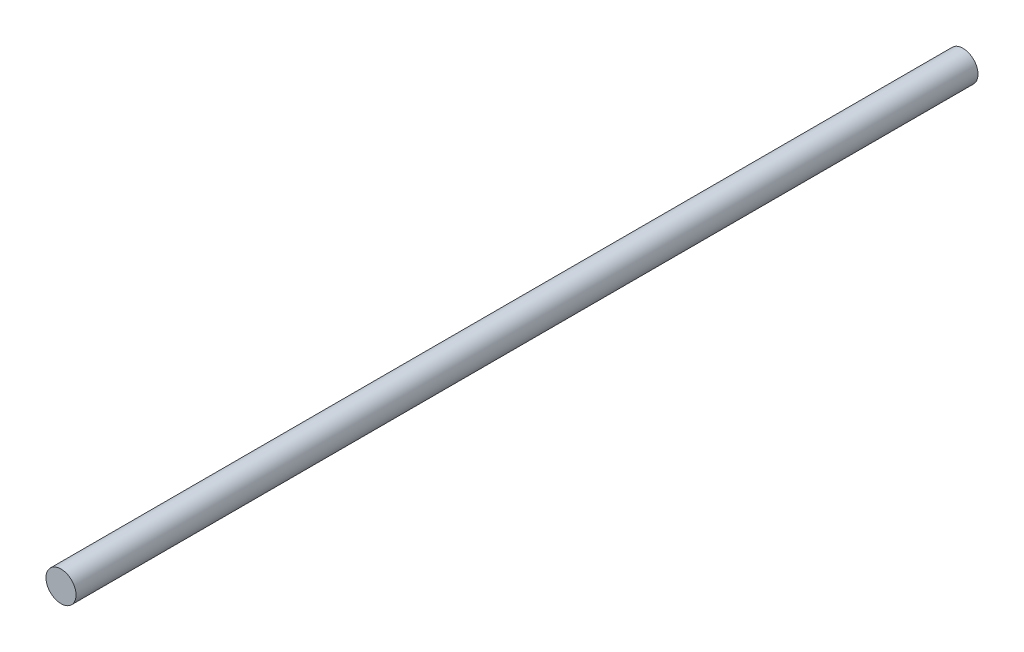
ISO-10303-21;
HEADER;
FILE_DESCRIPTION(('STEP AP214'),'2;1');
FILE_NAME('part.step','',(''),(''),'','','');
FILE_SCHEMA(('AUTOMOTIVE_DESIGN { 1 0 10303 214 1 1 1 1 }'));
ENDSEC;
DATA;
#1=APPLICATION_CONTEXT('core data for automotive mechanical design processes');
#2=APPLICATION_PROTOCOL_DEFINITION('international standard','automotive_design',2000,#1);
#3=PRODUCT_CONTEXT('',#1,'mechanical');
#4=PRODUCT('Part','Part','',(#3));
#5=PRODUCT_RELATED_PRODUCT_CATEGORY('part','',(#4));
#6=PRODUCT_DEFINITION_FORMATION('','',#4);
#7=PRODUCT_DEFINITION_CONTEXT('part definition',#1,'design');
#8=PRODUCT_DEFINITION('design','',#6,#7);
#9=PRODUCT_DEFINITION_SHAPE('','',#8);
#10=(LENGTH_UNIT() NAMED_UNIT(*) SI_UNIT(.MILLI.,.METRE.));
#11=(NAMED_UNIT(*) PLANE_ANGLE_UNIT() SI_UNIT($,.RADIAN.));
#12=(NAMED_UNIT(*) SI_UNIT($,.STERADIAN.) SOLID_ANGLE_UNIT());
#13=UNCERTAINTY_MEASURE_WITH_UNIT(LENGTH_MEASURE(1.E-05),#10,'distance_accuracy_value','');
#14=(GEOMETRIC_REPRESENTATION_CONTEXT(3) GLOBAL_UNCERTAINTY_ASSIGNED_CONTEXT((#13)) GLOBAL_UNIT_ASSIGNED_CONTEXT((#10,
#11,#12)) REPRESENTATION_CONTEXT('',''));
#15=CARTESIAN_POINT('',(0.,0.,0.));
#16=DIRECTION('',(0.,0.,1.));
#17=DIRECTION('',(1.,0.,0.));
#18=AXIS2_PLACEMENT_3D('',#15,#16,#17);
#19=CARTESIAN_POINT('',(0.,0.,120.));
#20=DIRECTION('',(0.,0.,-1.));
#21=DIRECTION('',(-1.,0.,0.));
#22=AXIS2_PLACEMENT_3D('',#19,#20,#21);
#23=CYLINDRICAL_SURFACE('',#22,2.);
#24=CARTESIAN_POINT('',(0.,0.,120.));
#25=DIRECTION('',(0.,0.,1.));
#26=DIRECTION('',(1.,0.,0.));
#27=AXIS2_PLACEMENT_3D('',#24,#25,#26);
#28=CIRCLE('',#27,2.);
#29=CARTESIAN_POINT('',(2.,0.,120.));
#30=VERTEX_POINT('',#29);
#31=EDGE_CURVE('E10',#30,#30,#28,.T.);
#32=ORIENTED_EDGE('',*,*,#31,.F.);
#33=EDGE_LOOP('',(#32));
#34=FACE_BOUND('',#33,.T.);
#35=CARTESIAN_POINT('',(0.,0.,0.));
#36=DIRECTION('',(0.,0.,1.));
#37=DIRECTION('',(1.,0.,0.));
#38=AXIS2_PLACEMENT_3D('',#35,#36,#37);
#39=CIRCLE('',#38,2.);
#40=CARTESIAN_POINT('',(2.,0.,0.));
#41=VERTEX_POINT('',#40);
#42=EDGE_CURVE('E31',#41,#41,#39,.T.);
#43=ORIENTED_EDGE('',*,*,#42,.T.);
#44=EDGE_LOOP('',(#43));
#45=FACE_BOUND('',#44,.T.);
#46=ADVANCED_FACE('F28',(#34,#45),#23,.T.);
#47=CARTESIAN_POINT('',(0.,0.,120.));
#48=DIRECTION('',(0.,0.,1.));
#49=DIRECTION('',(1.,0.,0.));
#50=AXIS2_PLACEMENT_3D('',#47,#48,#49);
#51=PLANE('',#50);
#52=ORIENTED_EDGE('',*,*,#31,.T.);
#53=EDGE_LOOP('',(#52));
#54=FACE_BOUND('',#53,.T.);
#55=ADVANCED_FACE('F43',(#54),#51,.T.);
#56=CARTESIAN_POINT('',(0.,0.,0.));
#57=DIRECTION('',(0.,0.,1.));
#58=DIRECTION('',(1.,0.,0.));
#59=AXIS2_PLACEMENT_3D('',#56,#57,#58);
#60=PLANE('',#59);
#61=ORIENTED_EDGE('',*,*,#42,.F.);
#62=EDGE_LOOP('',(#61));
#63=FACE_BOUND('',#62,.T.);
#64=ADVANCED_FACE('F41',(#63),#60,.F.);
#65=CLOSED_SHELL('',(#46,#55,#64));
#66=MANIFOLD_SOLID_BREP('B2',#65);
#67=ADVANCED_BREP_SHAPE_REPRESENTATION('',(#18,#66),#14);
#68=SHAPE_DEFINITION_REPRESENTATION(#9,#67);
ENDSEC;
END-ISO-10303-21;
